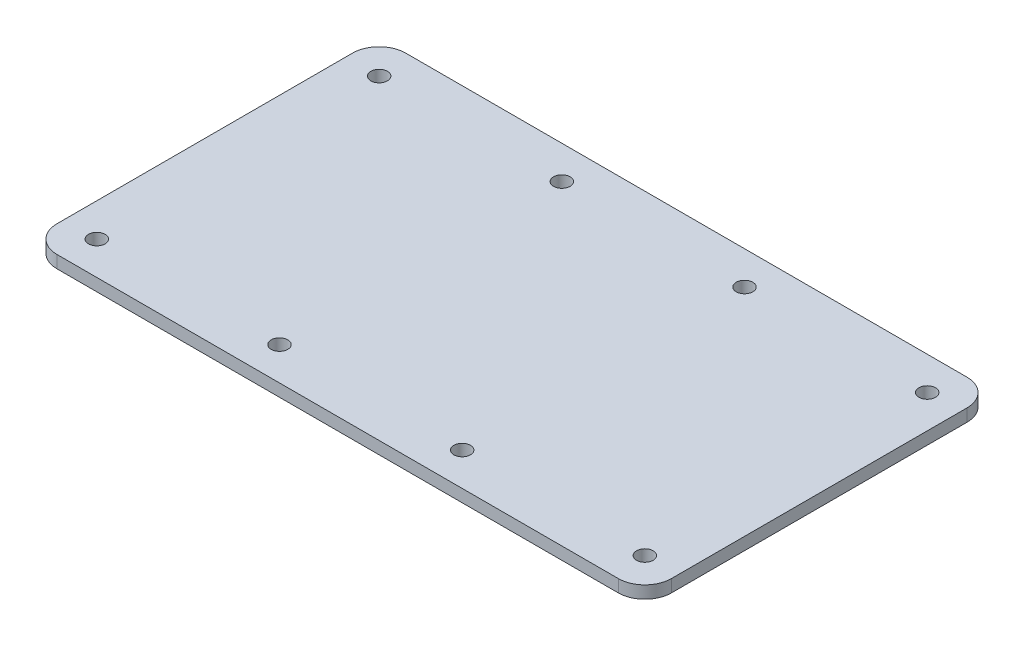
ISO-10303-21;
HEADER;
FILE_DESCRIPTION(('STEP AP214'),'2;1');
FILE_NAME('part.step','',(''),(''),'','','');
FILE_SCHEMA(('AUTOMOTIVE_DESIGN { 1 0 10303 214 1 1 1 1 }'));
ENDSEC;
DATA;
#1=APPLICATION_CONTEXT('core data for automotive mechanical design processes');
#2=APPLICATION_PROTOCOL_DEFINITION('international standard','automotive_design',2000,#1);
#3=PRODUCT_CONTEXT('',#1,'mechanical');
#4=PRODUCT('Part','Part','',(#3));
#5=PRODUCT_RELATED_PRODUCT_CATEGORY('part','',(#4));
#6=PRODUCT_DEFINITION_FORMATION('','',#4);
#7=PRODUCT_DEFINITION_CONTEXT('part definition',#1,'design');
#8=PRODUCT_DEFINITION('design','',#6,#7);
#9=PRODUCT_DEFINITION_SHAPE('','',#8);
#10=(LENGTH_UNIT() NAMED_UNIT(*) SI_UNIT(.MILLI.,.METRE.));
#11=(NAMED_UNIT(*) PLANE_ANGLE_UNIT() SI_UNIT($,.RADIAN.));
#12=(NAMED_UNIT(*) SI_UNIT($,.STERADIAN.) SOLID_ANGLE_UNIT());
#13=UNCERTAINTY_MEASURE_WITH_UNIT(LENGTH_MEASURE(1.E-05),#10,'distance_accuracy_value','');
#14=(GEOMETRIC_REPRESENTATION_CONTEXT(3) GLOBAL_UNCERTAINTY_ASSIGNED_CONTEXT((#13)) GLOBAL_UNIT_ASSIGNED_CONTEXT((#10,
#11,#12)) REPRESENTATION_CONTEXT('',''));
#15=CARTESIAN_POINT('',(0.,0.,0.));
#16=DIRECTION('',(0.,0.,1.));
#17=DIRECTION('',(1.,0.,0.));
#18=AXIS2_PLACEMENT_3D('',#15,#16,#17);
#19=CARTESIAN_POINT('',(0.,4.7625,0.));
#20=DIRECTION('',(0.,-1.,0.));
#21=DIRECTION('',(0.,0.,-1.));
#22=AXIS2_PLACEMENT_3D('',#19,#20,#21);
#23=PLANE('',#22);
#24=CARTESIAN_POINT('',(152.4,4.7625,-12.7));
#25=DIRECTION('',(0.,1.,0.));
#26=DIRECTION('',(0.,0.,1.));
#27=AXIS2_PLACEMENT_3D('',#24,#25,#26);
#28=CIRCLE('',#27,3.17499999999998);
#29=CARTESIAN_POINT('',(152.4,4.7625,-9.52500000000001));
#30=VERTEX_POINT('',#29);
#31=EDGE_CURVE('E225',#30,#30,#28,.T.);
#32=ORIENTED_EDGE('',*,*,#31,.F.);
#33=EDGE_LOOP('',(#32));
#34=FACE_BOUND('',#33,.T.);
#35=CARTESIAN_POINT('',(12.7,4.7625,-120.65));
#36=DIRECTION('',(0.,1.,0.));
#37=DIRECTION('',(0.,0.,1.));
#38=AXIS2_PLACEMENT_3D('',#35,#36,#37);
#39=CIRCLE('',#38,3.17499999999999);
#40=CARTESIAN_POINT('',(12.7,4.7625,-117.475));
#41=VERTEX_POINT('',#40);
#42=EDGE_CURVE('E213',#41,#41,#39,.T.);
#43=ORIENTED_EDGE('',*,*,#42,.F.);
#44=EDGE_LOOP('',(#43));
#45=FACE_BOUND('',#44,.T.);
#46=CARTESIAN_POINT('',(82.55,4.7625,-120.65));
#47=DIRECTION('',(0.,1.,0.));
#48=DIRECTION('',(0.,0.,1.));
#49=AXIS2_PLACEMENT_3D('',#46,#47,#48);
#50=CIRCLE('',#49,3.17499999999998);
#51=CARTESIAN_POINT('',(82.55,4.7625,-117.475));
#52=VERTEX_POINT('',#51);
#53=EDGE_CURVE('E207',#52,#52,#50,.T.);
#54=ORIENTED_EDGE('',*,*,#53,.F.);
#55=EDGE_LOOP('',(#54));
#56=FACE_BOUND('',#55,.T.);
#57=CARTESIAN_POINT('',(152.4,4.7625,-120.65));
#58=DIRECTION('',(0.,1.,0.));
#59=DIRECTION('',(0.,0.,1.));
#60=AXIS2_PLACEMENT_3D('',#57,#58,#59);
#61=CIRCLE('',#60,3.17499999999998);
#62=CARTESIAN_POINT('',(152.4,4.7625,-117.475));
#63=VERTEX_POINT('',#62);
#64=EDGE_CURVE('E201',#63,#63,#61,.T.);
#65=ORIENTED_EDGE('',*,*,#64,.F.);
#66=EDGE_LOOP('',(#65));
#67=FACE_BOUND('',#66,.T.);
#68=CARTESIAN_POINT('',(222.25,4.7625,-120.65));
#69=DIRECTION('',(0.,1.,0.));
#70=DIRECTION('',(0.,0.,1.));
#71=AXIS2_PLACEMENT_3D('',#68,#69,#70);
#72=CIRCLE('',#71,3.17499999999998);
#73=CARTESIAN_POINT('',(222.25,4.7625,-117.475));
#74=VERTEX_POINT('',#73);
#75=EDGE_CURVE('E150',#74,#74,#72,.T.);
#76=ORIENTED_EDGE('',*,*,#75,.F.);
#77=EDGE_LOOP('',(#76));
#78=FACE_BOUND('',#77,.T.);
#79=DIRECTION('',(-1.,0.,0.));
#80=VECTOR('',#79,1.);
#81=CARTESIAN_POINT('',(0.,4.7625,-133.35));
#82=LINE('',#81,#80);
#83=CARTESIAN_POINT('',(224.79,4.7625,-133.35));
#84=VERTEX_POINT('',#83);
#85=CARTESIAN_POINT('',(10.16,4.7625,-133.35));
#86=VERTEX_POINT('',#85);
#87=EDGE_CURVE('E153',#84,#86,#82,.T.);
#88=ORIENTED_EDGE('',*,*,#87,.T.);
#89=CARTESIAN_POINT('',(10.16,4.7625,-123.19));
#90=DIRECTION('',(0.,-1.,0.));
#91=DIRECTION('',(0.,0.,-1.));
#92=AXIS2_PLACEMENT_3D('',#89,#90,#91);
#93=CIRCLE('',#92,10.16);
#94=CARTESIAN_POINT('',(0.,4.7625,-123.19));
#95=VERTEX_POINT('',#94);
#96=EDGE_CURVE('E172',#86,#95,#93,.F.);
#97=ORIENTED_EDGE('',*,*,#96,.T.);
#98=DIRECTION('',(0.,0.,1.));
#99=VECTOR('',#98,1.);
#100=CARTESIAN_POINT('',(0.,4.7625,0.));
#101=LINE('',#100,#99);
#102=CARTESIAN_POINT('',(0.,4.7625,-10.16));
#103=VERTEX_POINT('',#102);
#104=EDGE_CURVE('E136',#95,#103,#101,.T.);
#105=ORIENTED_EDGE('',*,*,#104,.T.);
#106=CARTESIAN_POINT('',(10.16,4.7625,-10.16));
#107=DIRECTION('',(0.,-1.,0.));
#108=DIRECTION('',(0.,0.,-1.));
#109=AXIS2_PLACEMENT_3D('',#106,#107,#108);
#110=CIRCLE('',#109,10.16);
#111=CARTESIAN_POINT('',(10.16,4.7625,0.));
#112=VERTEX_POINT('',#111);
#113=EDGE_CURVE('E170',#103,#112,#110,.F.);
#114=ORIENTED_EDGE('',*,*,#113,.T.);
#115=DIRECTION('',(1.,0.,0.));
#116=VECTOR('',#115,1.);
#117=CARTESIAN_POINT('',(0.,4.7625,0.));
#118=LINE('',#117,#116);
#119=CARTESIAN_POINT('',(224.79,4.7625,0.));
#120=VERTEX_POINT('',#119);
#121=EDGE_CURVE('E192',#112,#120,#118,.T.);
#122=ORIENTED_EDGE('',*,*,#121,.T.);
#123=CARTESIAN_POINT('',(224.79,4.7625,-10.16));
#124=DIRECTION('',(0.,-1.,0.));
#125=DIRECTION('',(0.,0.,-1.));
#126=AXIS2_PLACEMENT_3D('',#123,#124,#125);
#127=CIRCLE('',#126,10.16);
#128=CARTESIAN_POINT('',(234.95,4.7625,-10.16));
#129=VERTEX_POINT('',#128);
#130=EDGE_CURVE('E71',#120,#129,#127,.F.);
#131=ORIENTED_EDGE('',*,*,#130,.T.);
#132=DIRECTION('',(0.,0.,-1.));
#133=VECTOR('',#132,1.);
#134=CARTESIAN_POINT('',(234.95,4.7625,0.));
#135=LINE('',#134,#133);
#136=CARTESIAN_POINT('',(234.95,4.7625,-123.19));
#137=VERTEX_POINT('',#136);
#138=EDGE_CURVE('E182',#129,#137,#135,.T.);
#139=ORIENTED_EDGE('',*,*,#138,.T.);
#140=CARTESIAN_POINT('',(224.79,4.7625,-123.19));
#141=DIRECTION('',(0.,-1.,0.));
#142=DIRECTION('',(0.,0.,-1.));
#143=AXIS2_PLACEMENT_3D('',#140,#141,#142);
#144=CIRCLE('',#143,10.16);
#145=EDGE_CURVE('E168',#137,#84,#144,.F.);
#146=ORIENTED_EDGE('',*,*,#145,.T.);
#147=EDGE_LOOP('',(#88,#97,#105,#114,#122,#131,#139,#146));
#148=FACE_BOUND('',#147,.T.);
#149=CARTESIAN_POINT('',(222.25,4.7625,-12.7));
#150=DIRECTION('',(0.,1.,0.));
#151=DIRECTION('',(0.,0.,1.));
#152=AXIS2_PLACEMENT_3D('',#149,#150,#151);
#153=CIRCLE('',#152,3.17499999999998);
#154=CARTESIAN_POINT('',(222.25,4.7625,-9.52500000000002));
#155=VERTEX_POINT('',#154);
#156=EDGE_CURVE('E219',#155,#155,#153,.T.);
#157=ORIENTED_EDGE('',*,*,#156,.F.);
#158=EDGE_LOOP('',(#157));
#159=FACE_BOUND('',#158,.T.);
#160=CARTESIAN_POINT('',(82.55,4.7625,-12.7));
#161=DIRECTION('',(0.,1.,0.));
#162=DIRECTION('',(0.,0.,1.));
#163=AXIS2_PLACEMENT_3D('',#160,#161,#162);
#164=CIRCLE('',#163,3.17499999999998);
#165=CARTESIAN_POINT('',(82.55,4.7625,-9.52500000000001));
#166=VERTEX_POINT('',#165);
#167=EDGE_CURVE('E231',#166,#166,#164,.T.);
#168=ORIENTED_EDGE('',*,*,#167,.F.);
#169=EDGE_LOOP('',(#168));
#170=FACE_BOUND('',#169,.T.);
#171=CARTESIAN_POINT('',(12.7,4.7625,-12.7));
#172=DIRECTION('',(0.,1.,0.));
#173=DIRECTION('',(0.,0.,1.));
#174=AXIS2_PLACEMENT_3D('',#171,#172,#173);
#175=CIRCLE('',#174,3.17499999999999);
#176=CARTESIAN_POINT('',(12.7,4.7625,-9.52500000000002));
#177=VERTEX_POINT('',#176);
#178=EDGE_CURVE('E237',#177,#177,#175,.T.);
#179=ORIENTED_EDGE('',*,*,#178,.F.);
#180=EDGE_LOOP('',(#179));
#181=FACE_BOUND('',#180,.T.);
#182=ADVANCED_FACE('F51',(#34,#45,#56,#67,#78,#148,#159,#170,#181),#23,.F.);
#183=CARTESIAN_POINT('',(0.,0.,0.));
#184=DIRECTION('',(0.,-1.,0.));
#185=DIRECTION('',(0.,0.,-1.));
#186=AXIS2_PLACEMENT_3D('',#183,#184,#185);
#187=PLANE('',#186);
#188=CARTESIAN_POINT('',(222.25,0.,-12.7));
#189=DIRECTION('',(0.,1.,0.));
#190=DIRECTION('',(0.,0.,1.));
#191=AXIS2_PLACEMENT_3D('',#188,#189,#190);
#192=CIRCLE('',#191,3.17500000000001);
#193=CARTESIAN_POINT('',(222.25,0.,-9.52499999999999));
#194=VERTEX_POINT('',#193);
#195=EDGE_CURVE('E216',#194,#194,#192,.T.);
#196=ORIENTED_EDGE('',*,*,#195,.T.);
#197=EDGE_LOOP('',(#196));
#198=FACE_BOUND('',#197,.T.);
#199=CARTESIAN_POINT('',(12.7,0.,-120.65));
#200=DIRECTION('',(0.,1.,0.));
#201=DIRECTION('',(0.,0.,1.));
#202=AXIS2_PLACEMENT_3D('',#199,#200,#201);
#203=CIRCLE('',#202,3.175);
#204=CARTESIAN_POINT('',(12.7,0.,-117.475));
#205=VERTEX_POINT('',#204);
#206=EDGE_CURVE('E210',#205,#205,#203,.T.);
#207=ORIENTED_EDGE('',*,*,#206,.T.);
#208=EDGE_LOOP('',(#207));
#209=FACE_BOUND('',#208,.T.);
#210=CARTESIAN_POINT('',(82.55,0.,-120.65));
#211=DIRECTION('',(0.,1.,0.));
#212=DIRECTION('',(0.,0.,1.));
#213=AXIS2_PLACEMENT_3D('',#210,#211,#212);
#214=CIRCLE('',#213,3.175);
#215=CARTESIAN_POINT('',(82.55,0.,-117.475));
#216=VERTEX_POINT('',#215);
#217=EDGE_CURVE('E204',#216,#216,#214,.T.);
#218=ORIENTED_EDGE('',*,*,#217,.T.);
#219=EDGE_LOOP('',(#218));
#220=FACE_BOUND('',#219,.T.);
#221=CARTESIAN_POINT('',(152.4,0.,-120.65));
#222=DIRECTION('',(0.,1.,0.));
#223=DIRECTION('',(0.,0.,1.));
#224=AXIS2_PLACEMENT_3D('',#221,#222,#223);
#225=CIRCLE('',#224,3.17500000000001);
#226=CARTESIAN_POINT('',(152.4,0.,-117.475));
#227=VERTEX_POINT('',#226);
#228=EDGE_CURVE('E198',#227,#227,#225,.T.);
#229=ORIENTED_EDGE('',*,*,#228,.T.);
#230=EDGE_LOOP('',(#229));
#231=FACE_BOUND('',#230,.T.);
#232=DIRECTION('',(0.,0.,1.));
#233=VECTOR('',#232,1.);
#234=CARTESIAN_POINT('',(0.,0.,0.));
#235=LINE('',#234,#233);
#236=CARTESIAN_POINT('',(0.,0.,-123.19));
#237=VERTEX_POINT('',#236);
#238=CARTESIAN_POINT('',(0.,0.,-10.16));
#239=VERTEX_POINT('',#238);
#240=EDGE_CURVE('E133',#237,#239,#235,.T.);
#241=ORIENTED_EDGE('',*,*,#240,.F.);
#242=CARTESIAN_POINT('',(10.16,0.,-123.19));
#243=DIRECTION('',(0.,-1.,0.));
#244=DIRECTION('',(0.,0.,-1.));
#245=AXIS2_PLACEMENT_3D('',#242,#243,#244);
#246=CIRCLE('',#245,10.16);
#247=CARTESIAN_POINT('',(10.16,0.,-133.35));
#248=VERTEX_POINT('',#247);
#249=EDGE_CURVE('E116',#237,#248,#246,.T.);
#250=ORIENTED_EDGE('',*,*,#249,.T.);
#251=DIRECTION('',(-1.,0.,0.));
#252=VECTOR('',#251,1.);
#253=CARTESIAN_POINT('',(0.,0.,-133.35));
#254=LINE('',#253,#252);
#255=CARTESIAN_POINT('',(224.79,0.,-133.35));
#256=VERTEX_POINT('',#255);
#257=EDGE_CURVE('E157',#256,#248,#254,.T.);
#258=ORIENTED_EDGE('',*,*,#257,.F.);
#259=CARTESIAN_POINT('',(224.79,0.,-123.19));
#260=DIRECTION('',(0.,-1.,0.));
#261=DIRECTION('',(0.,0.,-1.));
#262=AXIS2_PLACEMENT_3D('',#259,#260,#261);
#263=CIRCLE('',#262,10.16);
#264=CARTESIAN_POINT('',(234.95,0.,-123.19));
#265=VERTEX_POINT('',#264);
#266=EDGE_CURVE('E161',#256,#265,#263,.T.);
#267=ORIENTED_EDGE('',*,*,#266,.T.);
#268=DIRECTION('',(0.,0.,-1.));
#269=VECTOR('',#268,1.);
#270=CARTESIAN_POINT('',(234.95,0.,0.));
#271=LINE('',#270,#269);
#272=CARTESIAN_POINT('',(234.95,0.,-10.16));
#273=VERTEX_POINT('',#272);
#274=EDGE_CURVE('E147',#273,#265,#271,.T.);
#275=ORIENTED_EDGE('',*,*,#274,.F.);
#276=CARTESIAN_POINT('',(224.79,0.,-10.16));
#277=DIRECTION('',(0.,-1.,0.));
#278=DIRECTION('',(0.,0.,-1.));
#279=AXIS2_PLACEMENT_3D('',#276,#277,#278);
#280=CIRCLE('',#279,10.16);
#281=CARTESIAN_POINT('',(224.79,0.,0.));
#282=VERTEX_POINT('',#281);
#283=EDGE_CURVE('E137',#273,#282,#280,.T.);
#284=ORIENTED_EDGE('',*,*,#283,.T.);
#285=DIRECTION('',(1.,0.,0.));
#286=VECTOR('',#285,1.);
#287=CARTESIAN_POINT('',(0.,0.,0.));
#288=LINE('',#287,#286);
#289=CARTESIAN_POINT('',(10.16,0.,0.));
#290=VERTEX_POINT('',#289);
#291=EDGE_CURVE('E143',#290,#282,#288,.T.);
#292=ORIENTED_EDGE('',*,*,#291,.F.);
#293=CARTESIAN_POINT('',(10.16,0.,-10.16));
#294=DIRECTION('',(0.,-1.,0.));
#295=DIRECTION('',(0.,0.,-1.));
#296=AXIS2_PLACEMENT_3D('',#293,#294,#295);
#297=CIRCLE('',#296,10.16);
#298=EDGE_CURVE('E127',#290,#239,#297,.T.);
#299=ORIENTED_EDGE('',*,*,#298,.T.);
#300=EDGE_LOOP('',(#241,#250,#258,#267,#275,#284,#292,#299));
#301=FACE_BOUND('',#300,.T.);
#302=CARTESIAN_POINT('',(222.25,0.,-120.65));
#303=DIRECTION('',(0.,1.,0.));
#304=DIRECTION('',(0.,0.,1.));
#305=AXIS2_PLACEMENT_3D('',#302,#303,#304);
#306=CIRCLE('',#305,3.17500000000001);
#307=CARTESIAN_POINT('',(222.25,0.,-117.475));
#308=VERTEX_POINT('',#307);
#309=EDGE_CURVE('E144',#308,#308,#306,.T.);
#310=ORIENTED_EDGE('',*,*,#309,.T.);
#311=EDGE_LOOP('',(#310));
#312=FACE_BOUND('',#311,.T.);
#313=CARTESIAN_POINT('',(152.4,0.,-12.7));
#314=DIRECTION('',(0.,1.,0.));
#315=DIRECTION('',(0.,0.,1.));
#316=AXIS2_PLACEMENT_3D('',#313,#314,#315);
#317=CIRCLE('',#316,3.17500000000001);
#318=CARTESIAN_POINT('',(152.4,0.,-9.52499999999998));
#319=VERTEX_POINT('',#318);
#320=EDGE_CURVE('E222',#319,#319,#317,.T.);
#321=ORIENTED_EDGE('',*,*,#320,.T.);
#322=EDGE_LOOP('',(#321));
#323=FACE_BOUND('',#322,.T.);
#324=CARTESIAN_POINT('',(82.55,0.,-12.7));
#325=DIRECTION('',(0.,1.,0.));
#326=DIRECTION('',(0.,0.,1.));
#327=AXIS2_PLACEMENT_3D('',#324,#325,#326);
#328=CIRCLE('',#327,3.175);
#329=CARTESIAN_POINT('',(82.55,0.,-9.52499999999999));
#330=VERTEX_POINT('',#329);
#331=EDGE_CURVE('E228',#330,#330,#328,.T.);
#332=ORIENTED_EDGE('',*,*,#331,.T.);
#333=EDGE_LOOP('',(#332));
#334=FACE_BOUND('',#333,.T.);
#335=CARTESIAN_POINT('',(12.7,0.,-12.7));
#336=DIRECTION('',(0.,1.,0.));
#337=DIRECTION('',(0.,0.,1.));
#338=AXIS2_PLACEMENT_3D('',#335,#336,#337);
#339=CIRCLE('',#338,3.175);
#340=CARTESIAN_POINT('',(12.7,0.,-9.52500000000001));
#341=VERTEX_POINT('',#340);
#342=EDGE_CURVE('E234',#341,#341,#339,.T.);
#343=ORIENTED_EDGE('',*,*,#342,.T.);
#344=EDGE_LOOP('',(#343));
#345=FACE_BOUND('',#344,.T.);
#346=ADVANCED_FACE('F140',(#198,#209,#220,#231,#301,#312,#323,#334,#345),#187,.T.);
#347=CARTESIAN_POINT('',(0.,4.7625,0.));
#348=DIRECTION('',(1.,0.,0.));
#349=DIRECTION('',(0.,0.,-1.));
#350=AXIS2_PLACEMENT_3D('',#347,#348,#349);
#351=PLANE('',#350);
#352=ORIENTED_EDGE('',*,*,#104,.F.);
#353=DIRECTION('',(0.,-1.,0.));
#354=VECTOR('',#353,1.);
#355=CARTESIAN_POINT('',(0.,4.7625,-123.19));
#356=LINE('',#355,#354);
#357=EDGE_CURVE('E120',#95,#237,#356,.T.);
#358=ORIENTED_EDGE('',*,*,#357,.T.);
#359=ORIENTED_EDGE('',*,*,#240,.T.);
#360=DIRECTION('',(0.,-1.,0.));
#361=VECTOR('',#360,1.);
#362=CARTESIAN_POINT('',(0.,4.7625,-10.16));
#363=LINE('',#362,#361);
#364=EDGE_CURVE('E138',#239,#103,#363,.F.);
#365=ORIENTED_EDGE('',*,*,#364,.T.);
#366=EDGE_LOOP('',(#352,#358,#359,#365));
#367=FACE_BOUND('',#366,.T.);
#368=ADVANCED_FACE('F132',(#367),#351,.F.);
#369=CARTESIAN_POINT('',(0.,4.7625,0.));
#370=DIRECTION('',(0.,0.,-1.));
#371=DIRECTION('',(-1.,0.,0.));
#372=AXIS2_PLACEMENT_3D('',#369,#370,#371);
#373=PLANE('',#372);
#374=ORIENTED_EDGE('',*,*,#121,.F.);
#375=DIRECTION('',(0.,-1.,0.));
#376=VECTOR('',#375,1.);
#377=CARTESIAN_POINT('',(10.16,4.7625,0.));
#378=LINE('',#377,#376);
#379=EDGE_CURVE('E176',#112,#290,#378,.T.);
#380=ORIENTED_EDGE('',*,*,#379,.T.);
#381=ORIENTED_EDGE('',*,*,#291,.T.);
#382=DIRECTION('',(0.,-1.,0.));
#383=VECTOR('',#382,1.);
#384=CARTESIAN_POINT('',(224.79,4.7625,0.));
#385=LINE('',#384,#383);
#386=EDGE_CURVE('E174',#282,#120,#385,.F.);
#387=ORIENTED_EDGE('',*,*,#386,.T.);
#388=EDGE_LOOP('',(#374,#380,#381,#387));
#389=FACE_BOUND('',#388,.T.);
#390=ADVANCED_FACE('F261',(#389),#373,.F.);
#391=CARTESIAN_POINT('',(234.95,4.7625,0.));
#392=DIRECTION('',(-1.,0.,0.));
#393=DIRECTION('',(0.,0.,1.));
#394=AXIS2_PLACEMENT_3D('',#391,#392,#393);
#395=PLANE('',#394);
#396=ORIENTED_EDGE('',*,*,#274,.T.);
#397=DIRECTION('',(0.,-1.,0.));
#398=VECTOR('',#397,1.);
#399=CARTESIAN_POINT('',(234.95,4.7625,-123.19));
#400=LINE('',#399,#398);
#401=EDGE_CURVE('E13',#265,#137,#400,.F.);
#402=ORIENTED_EDGE('',*,*,#401,.T.);
#403=ORIENTED_EDGE('',*,*,#138,.F.);
#404=DIRECTION('',(0.,-1.,0.));
#405=VECTOR('',#404,1.);
#406=CARTESIAN_POINT('',(234.95,4.7625,-10.16));
#407=LINE('',#406,#405);
#408=EDGE_CURVE('E59',#129,#273,#407,.T.);
#409=ORIENTED_EDGE('',*,*,#408,.T.);
#410=EDGE_LOOP('',(#396,#402,#403,#409));
#411=FACE_BOUND('',#410,.T.);
#412=ADVANCED_FACE('F181',(#411),#395,.F.);
#413=CARTESIAN_POINT('',(0.,4.7625,-133.35));
#414=DIRECTION('',(0.,0.,1.));
#415=DIRECTION('',(1.,0.,0.));
#416=AXIS2_PLACEMENT_3D('',#413,#414,#415);
#417=PLANE('',#416);
#418=ORIENTED_EDGE('',*,*,#257,.T.);
#419=DIRECTION('',(0.,-1.,0.));
#420=VECTOR('',#419,1.);
#421=CARTESIAN_POINT('',(10.16,4.7625,-133.35));
#422=LINE('',#421,#420);
#423=EDGE_CURVE('E121',#248,#86,#422,.F.);
#424=ORIENTED_EDGE('',*,*,#423,.T.);
#425=ORIENTED_EDGE('',*,*,#87,.F.);
#426=DIRECTION('',(0.,-1.,0.));
#427=VECTOR('',#426,1.);
#428=CARTESIAN_POINT('',(224.79,4.7625,-133.35));
#429=LINE('',#428,#427);
#430=EDGE_CURVE('E126',#84,#256,#429,.T.);
#431=ORIENTED_EDGE('',*,*,#430,.T.);
#432=EDGE_LOOP('',(#418,#424,#425,#431));
#433=FACE_BOUND('',#432,.T.);
#434=ADVANCED_FACE('F190',(#433),#417,.F.);
#435=CARTESIAN_POINT('',(10.16,4.7625,-123.19));
#436=DIRECTION('',(0.,-1.,0.));
#437=DIRECTION('',(0.,0.,-1.));
#438=AXIS2_PLACEMENT_3D('',#435,#436,#437);
#439=CYLINDRICAL_SURFACE('',#438,10.16);
#440=ORIENTED_EDGE('',*,*,#96,.F.);
#441=ORIENTED_EDGE('',*,*,#423,.F.);
#442=ORIENTED_EDGE('',*,*,#249,.F.);
#443=ORIENTED_EDGE('',*,*,#357,.F.);
#444=EDGE_LOOP('',(#440,#441,#442,#443));
#445=FACE_BOUND('',#444,.T.);
#446=ADVANCED_FACE('F119',(#445),#439,.T.);
#447=CARTESIAN_POINT('',(10.16,4.7625,-10.16));
#448=DIRECTION('',(0.,-1.,0.));
#449=DIRECTION('',(0.,0.,-1.));
#450=AXIS2_PLACEMENT_3D('',#447,#448,#449);
#451=CYLINDRICAL_SURFACE('',#450,10.16);
#452=ORIENTED_EDGE('',*,*,#113,.F.);
#453=ORIENTED_EDGE('',*,*,#364,.F.);
#454=ORIENTED_EDGE('',*,*,#298,.F.);
#455=ORIENTED_EDGE('',*,*,#379,.F.);
#456=EDGE_LOOP('',(#452,#453,#454,#455));
#457=FACE_BOUND('',#456,.T.);
#458=ADVANCED_FACE('F269',(#457),#451,.T.);
#459=CARTESIAN_POINT('',(224.79,4.7625,-123.19));
#460=DIRECTION('',(0.,-1.,0.));
#461=DIRECTION('',(0.,0.,-1.));
#462=AXIS2_PLACEMENT_3D('',#459,#460,#461);
#463=CYLINDRICAL_SURFACE('',#462,10.16);
#464=ORIENTED_EDGE('',*,*,#145,.F.);
#465=ORIENTED_EDGE('',*,*,#401,.F.);
#466=ORIENTED_EDGE('',*,*,#266,.F.);
#467=ORIENTED_EDGE('',*,*,#430,.F.);
#468=EDGE_LOOP('',(#464,#465,#466,#467));
#469=FACE_BOUND('',#468,.T.);
#470=ADVANCED_FACE('F187',(#469),#463,.T.);
#471=CARTESIAN_POINT('',(224.79,4.7625,-10.16));
#472=DIRECTION('',(0.,-1.,0.));
#473=DIRECTION('',(0.,0.,-1.));
#474=AXIS2_PLACEMENT_3D('',#471,#472,#473);
#475=CYLINDRICAL_SURFACE('',#474,10.16);
#476=ORIENTED_EDGE('',*,*,#130,.F.);
#477=ORIENTED_EDGE('',*,*,#386,.F.);
#478=ORIENTED_EDGE('',*,*,#283,.F.);
#479=ORIENTED_EDGE('',*,*,#408,.F.);
#480=EDGE_LOOP('',(#476,#477,#478,#479));
#481=FACE_BOUND('',#480,.T.);
#482=ADVANCED_FACE('F53',(#481),#475,.T.);
#483=CARTESIAN_POINT('',(222.25,4.7625,-120.65));
#484=DIRECTION('',(0.,1.,0.));
#485=DIRECTION('',(0.,0.,1.));
#486=AXIS2_PLACEMENT_3D('',#483,#484,#485);
#487=CYLINDRICAL_SURFACE('',#486,3.175);
#488=ORIENTED_EDGE('',*,*,#309,.F.);
#489=EDGE_LOOP('',(#488));
#490=FACE_BOUND('',#489,.T.);
#491=ORIENTED_EDGE('',*,*,#75,.T.);
#492=EDGE_LOOP('',(#491));
#493=FACE_BOUND('',#492,.T.);
#494=ADVANCED_FACE('F254',(#490,#493),#487,.F.);
#495=CARTESIAN_POINT('',(152.4,4.7625,-120.65));
#496=DIRECTION('',(0.,1.,0.));
#497=DIRECTION('',(0.,0.,1.));
#498=AXIS2_PLACEMENT_3D('',#495,#496,#497);
#499=CYLINDRICAL_SURFACE('',#498,3.175);
#500=ORIENTED_EDGE('',*,*,#228,.F.);
#501=EDGE_LOOP('',(#500));
#502=FACE_BOUND('',#501,.T.);
#503=ORIENTED_EDGE('',*,*,#64,.T.);
#504=EDGE_LOOP('',(#503));
#505=FACE_BOUND('',#504,.T.);
#506=ADVANCED_FACE('F279',(#502,#505),#499,.F.);
#507=CARTESIAN_POINT('',(82.55,4.7625,-120.65));
#508=DIRECTION('',(0.,1.,0.));
#509=DIRECTION('',(0.,0.,1.));
#510=AXIS2_PLACEMENT_3D('',#507,#508,#509);
#511=CYLINDRICAL_SURFACE('',#510,3.17499999999999);
#512=ORIENTED_EDGE('',*,*,#217,.F.);
#513=EDGE_LOOP('',(#512));
#514=FACE_BOUND('',#513,.T.);
#515=ORIENTED_EDGE('',*,*,#53,.T.);
#516=EDGE_LOOP('',(#515));
#517=FACE_BOUND('',#516,.T.);
#518=ADVANCED_FACE('F312',(#514,#517),#511,.F.);
#519=CARTESIAN_POINT('',(12.7,4.7625,-120.65));
#520=DIRECTION('',(0.,1.,0.));
#521=DIRECTION('',(0.,0.,1.));
#522=AXIS2_PLACEMENT_3D('',#519,#520,#521);
#523=CYLINDRICAL_SURFACE('',#522,3.17499999999999);
#524=ORIENTED_EDGE('',*,*,#206,.F.);
#525=EDGE_LOOP('',(#524));
#526=FACE_BOUND('',#525,.T.);
#527=ORIENTED_EDGE('',*,*,#42,.T.);
#528=EDGE_LOOP('',(#527));
#529=FACE_BOUND('',#528,.T.);
#530=ADVANCED_FACE('F308',(#526,#529),#523,.F.);
#531=CARTESIAN_POINT('',(222.25,4.7625,-12.7));
#532=DIRECTION('',(0.,1.,0.));
#533=DIRECTION('',(0.,0.,1.));
#534=AXIS2_PLACEMENT_3D('',#531,#532,#533);
#535=CYLINDRICAL_SURFACE('',#534,3.175);
#536=ORIENTED_EDGE('',*,*,#195,.F.);
#537=EDGE_LOOP('',(#536));
#538=FACE_BOUND('',#537,.T.);
#539=ORIENTED_EDGE('',*,*,#156,.T.);
#540=EDGE_LOOP('',(#539));
#541=FACE_BOUND('',#540,.T.);
#542=ADVANCED_FACE('F301',(#538,#541),#535,.F.);
#543=CARTESIAN_POINT('',(152.4,4.7625,-12.7));
#544=DIRECTION('',(0.,1.,0.));
#545=DIRECTION('',(0.,0.,1.));
#546=AXIS2_PLACEMENT_3D('',#543,#544,#545);
#547=CYLINDRICAL_SURFACE('',#546,3.175);
#548=ORIENTED_EDGE('',*,*,#320,.F.);
#549=EDGE_LOOP('',(#548));
#550=FACE_BOUND('',#549,.T.);
#551=ORIENTED_EDGE('',*,*,#31,.T.);
#552=EDGE_LOOP('',(#551));
#553=FACE_BOUND('',#552,.T.);
#554=ADVANCED_FACE('F292',(#550,#553),#547,.F.);
#555=CARTESIAN_POINT('',(82.55,4.7625,-12.7));
#556=DIRECTION('',(0.,1.,0.));
#557=DIRECTION('',(0.,0.,1.));
#558=AXIS2_PLACEMENT_3D('',#555,#556,#557);
#559=CYLINDRICAL_SURFACE('',#558,3.17499999999999);
#560=ORIENTED_EDGE('',*,*,#331,.F.);
#561=EDGE_LOOP('',(#560));
#562=FACE_BOUND('',#561,.T.);
#563=ORIENTED_EDGE('',*,*,#167,.T.);
#564=EDGE_LOOP('',(#563));
#565=FACE_BOUND('',#564,.T.);
#566=ADVANCED_FACE('F290',(#562,#565),#559,.F.);
#567=CARTESIAN_POINT('',(12.7,4.7625,-12.7));
#568=DIRECTION('',(0.,1.,0.));
#569=DIRECTION('',(0.,0.,1.));
#570=AXIS2_PLACEMENT_3D('',#567,#568,#569);
#571=CYLINDRICAL_SURFACE('',#570,3.17499999999999);
#572=ORIENTED_EDGE('',*,*,#342,.F.);
#573=EDGE_LOOP('',(#572));
#574=FACE_BOUND('',#573,.T.);
#575=ORIENTED_EDGE('',*,*,#178,.T.);
#576=EDGE_LOOP('',(#575));
#577=FACE_BOUND('',#576,.T.);
#578=ADVANCED_FACE('F241',(#574,#577),#571,.F.);
#579=CLOSED_SHELL('',(#182,#346,#368,#390,#412,#434,#446,#458,#470,#482,#494,#506,#518,#530,
#542,#554,#566,#578));
#580=MANIFOLD_SOLID_BREP('B2',#579);
#581=ADVANCED_BREP_SHAPE_REPRESENTATION('',(#18,#580),#14);
#582=SHAPE_DEFINITION_REPRESENTATION(#9,#581);
ENDSEC;
END-ISO-10303-21;
